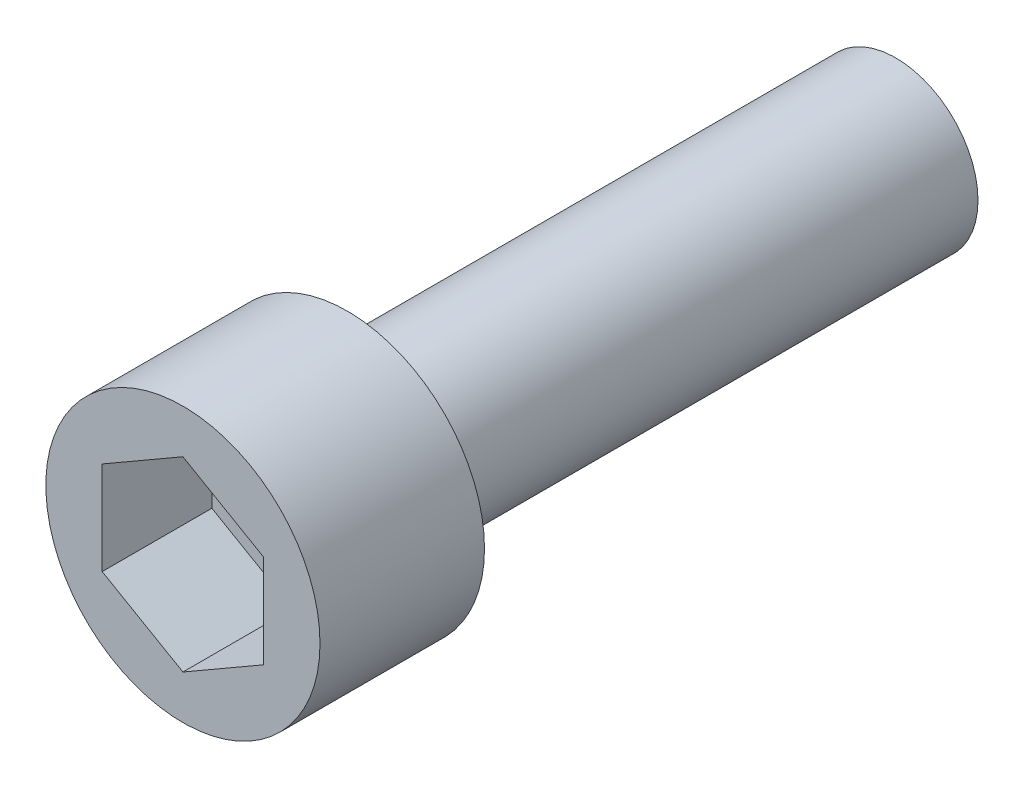
ISO-10303-21;
HEADER;
FILE_DESCRIPTION(('STEP AP214'),'2;1');
FILE_NAME('part.step','',(''),(''),'','','');
FILE_SCHEMA(('AUTOMOTIVE_DESIGN { 1 0 10303 214 1 1 1 1 }'));
ENDSEC;
DATA;
#1=APPLICATION_CONTEXT('core data for automotive mechanical design processes');
#2=APPLICATION_PROTOCOL_DEFINITION('international standard','automotive_design',2000,#1);
#3=PRODUCT_CONTEXT('',#1,'mechanical');
#4=PRODUCT('Part','Part','',(#3));
#5=PRODUCT_RELATED_PRODUCT_CATEGORY('part','',(#4));
#6=PRODUCT_DEFINITION_FORMATION('','',#4);
#7=PRODUCT_DEFINITION_CONTEXT('part definition',#1,'design');
#8=PRODUCT_DEFINITION('design','',#6,#7);
#9=PRODUCT_DEFINITION_SHAPE('','',#8);
#10=(LENGTH_UNIT() NAMED_UNIT(*) SI_UNIT(.MILLI.,.METRE.));
#11=(NAMED_UNIT(*) PLANE_ANGLE_UNIT() SI_UNIT($,.RADIAN.));
#12=(NAMED_UNIT(*) SI_UNIT($,.STERADIAN.) SOLID_ANGLE_UNIT());
#13=UNCERTAINTY_MEASURE_WITH_UNIT(LENGTH_MEASURE(1.E-05),#10,'distance_accuracy_value','');
#14=(GEOMETRIC_REPRESENTATION_CONTEXT(3) GLOBAL_UNCERTAINTY_ASSIGNED_CONTEXT((#13)) GLOBAL_UNIT_ASSIGNED_CONTEXT((#10,
#11,#12)) REPRESENTATION_CONTEXT('',''));
#15=CARTESIAN_POINT('',(0.,0.,0.));
#16=DIRECTION('',(0.,0.,1.));
#17=DIRECTION('',(1.,0.,0.));
#18=AXIS2_PLACEMENT_3D('',#15,#16,#17);
#19=CARTESIAN_POINT('',(0.,0.,10.));
#20=DIRECTION('',(0.,0.,-1.));
#21=DIRECTION('',(-1.,0.,0.));
#22=AXIS2_PLACEMENT_3D('',#19,#20,#21);
#23=CYLINDRICAL_SURFACE('',#22,1.5);
#24=CARTESIAN_POINT('',(0.,0.,10.));
#25=DIRECTION('',(0.,0.,1.));
#26=DIRECTION('',(1.,0.,0.));
#27=AXIS2_PLACEMENT_3D('',#24,#25,#26);
#28=CIRCLE('',#27,1.5);
#29=CARTESIAN_POINT('',(1.5,0.,10.));
#30=VERTEX_POINT('',#29);
#31=EDGE_CURVE('E11',#30,#30,#28,.T.);
#32=ORIENTED_EDGE('',*,*,#31,.F.);
#33=EDGE_LOOP('',(#32));
#34=FACE_BOUND('',#33,.T.);
#35=CARTESIAN_POINT('',(0.,0.,0.));
#36=DIRECTION('',(0.,0.,1.));
#37=DIRECTION('',(1.,0.,0.));
#38=AXIS2_PLACEMENT_3D('',#35,#36,#37);
#39=CIRCLE('',#38,1.5);
#40=CARTESIAN_POINT('',(1.5,0.,0.));
#41=VERTEX_POINT('',#40);
#42=EDGE_CURVE('E42',#41,#41,#39,.T.);
#43=ORIENTED_EDGE('',*,*,#42,.T.);
#44=EDGE_LOOP('',(#43));
#45=FACE_BOUND('',#44,.T.);
#46=ADVANCED_FACE('F39',(#34,#45),#23,.T.);
#47=CARTESIAN_POINT('',(0.,0.,0.));
#48=DIRECTION('',(0.,0.,1.));
#49=DIRECTION('',(1.,0.,0.));
#50=AXIS2_PLACEMENT_3D('',#47,#48,#49);
#51=PLANE('',#50);
#52=ORIENTED_EDGE('',*,*,#42,.F.);
#53=EDGE_LOOP('',(#52));
#54=FACE_BOUND('',#53,.T.);
#55=ADVANCED_FACE('F170',(#54),#51,.F.);
#56=CARTESIAN_POINT('',(0.,0.,13.));
#57=DIRECTION('',(0.,0.,-1.));
#58=DIRECTION('',(-1.,0.,0.));
#59=AXIS2_PLACEMENT_3D('',#56,#57,#58);
#60=CYLINDRICAL_SURFACE('',#59,2.5);
#61=CARTESIAN_POINT('',(0.,0.,13.));
#62=DIRECTION('',(0.,0.,1.));
#63=DIRECTION('',(1.,0.,0.));
#64=AXIS2_PLACEMENT_3D('',#61,#62,#63);
#65=CIRCLE('',#64,2.5);
#66=CARTESIAN_POINT('',(2.5,0.,13.));
#67=VERTEX_POINT('',#66);
#68=EDGE_CURVE('E146',#67,#67,#65,.T.);
#69=ORIENTED_EDGE('',*,*,#68,.F.);
#70=EDGE_LOOP('',(#69));
#71=FACE_BOUND('',#70,.T.);
#72=CARTESIAN_POINT('',(0.,0.,10.));
#73=DIRECTION('',(0.,0.,1.));
#74=DIRECTION('',(1.,0.,0.));
#75=AXIS2_PLACEMENT_3D('',#72,#73,#74);
#76=CIRCLE('',#75,2.5);
#77=CARTESIAN_POINT('',(2.5,0.,10.));
#78=VERTEX_POINT('',#77);
#79=EDGE_CURVE('E140',#78,#78,#76,.T.);
#80=ORIENTED_EDGE('',*,*,#79,.T.);
#81=EDGE_LOOP('',(#80));
#82=FACE_BOUND('',#81,.T.);
#83=ADVANCED_FACE('F152',(#71,#82),#60,.T.);
#84=CARTESIAN_POINT('',(0.,0.,13.));
#85=DIRECTION('',(0.,0.,1.));
#86=DIRECTION('',(1.,0.,0.));
#87=AXIS2_PLACEMENT_3D('',#84,#85,#86);
#88=PLANE('',#87);
#89=DIRECTION('',(-0.866025403784439,0.5,0.));
#90=VECTOR('',#89,1.);
#91=CARTESIAN_POINT('',(1.47224318643354,0.85,13.));
#92=LINE('',#91,#90);
#93=CARTESIAN_POINT('',(1.47224318643354,0.85,13.));
#94=VERTEX_POINT('',#93);
#95=CARTESIAN_POINT('',(0.,1.7,13.));
#96=VERTEX_POINT('',#95);
#97=EDGE_CURVE('E53',#94,#96,#92,.T.);
#98=ORIENTED_EDGE('',*,*,#97,.F.);
#99=DIRECTION('',(0.,1.,0.));
#100=VECTOR('',#99,1.);
#101=CARTESIAN_POINT('',(1.47224318643354,-0.85,13.));
#102=LINE('',#101,#100);
#103=CARTESIAN_POINT('',(1.47224318643354,-0.85,13.));
#104=VERTEX_POINT('',#103);
#105=EDGE_CURVE('E136',#104,#94,#102,.T.);
#106=ORIENTED_EDGE('',*,*,#105,.F.);
#107=DIRECTION('',(0.866025403784439,0.5,0.));
#108=VECTOR('',#107,1.);
#109=CARTESIAN_POINT('',(0.,-1.7,13.));
#110=LINE('',#109,#108);
#111=CARTESIAN_POINT('',(0.,-1.7,13.));
#112=VERTEX_POINT('',#111);
#113=EDGE_CURVE('E134',#112,#104,#110,.T.);
#114=ORIENTED_EDGE('',*,*,#113,.F.);
#115=DIRECTION('',(0.866025403784438,-0.5,0.));
#116=VECTOR('',#115,1.);
#117=CARTESIAN_POINT('',(-1.47224318643354,-0.849999999999999,13.));
#118=LINE('',#117,#116);
#119=CARTESIAN_POINT('',(-1.47224318643354,-0.849999999999999,13.));
#120=VERTEX_POINT('',#119);
#121=EDGE_CURVE('E101',#120,#112,#118,.T.);
#122=ORIENTED_EDGE('',*,*,#121,.F.);
#123=DIRECTION('',(0.,-1.,0.));
#124=VECTOR('',#123,1.);
#125=CARTESIAN_POINT('',(-1.47224318643354,0.85,13.));
#126=LINE('',#125,#124);
#127=CARTESIAN_POINT('',(-1.47224318643354,0.85,13.));
#128=VERTEX_POINT('',#127);
#129=EDGE_CURVE('E130',#128,#120,#126,.T.);
#130=ORIENTED_EDGE('',*,*,#129,.F.);
#131=DIRECTION('',(-0.866025403784439,-0.5,0.));
#132=VECTOR('',#131,1.);
#133=CARTESIAN_POINT('',(0.,1.7,13.));
#134=LINE('',#133,#132);
#135=EDGE_CURVE('E127',#96,#128,#134,.T.);
#136=ORIENTED_EDGE('',*,*,#135,.F.);
#137=EDGE_LOOP('',(#98,#106,#114,#122,#130,#136));
#138=FACE_BOUND('',#137,.T.);
#139=ORIENTED_EDGE('',*,*,#68,.T.);
#140=EDGE_LOOP('',(#139));
#141=FACE_BOUND('',#140,.T.);
#142=ADVANCED_FACE('F157',(#138,#141),#88,.T.);
#143=CARTESIAN_POINT('',(0.,0.,10.));
#144=DIRECTION('',(0.,0.,1.));
#145=DIRECTION('',(1.,0.,0.));
#146=AXIS2_PLACEMENT_3D('',#143,#144,#145);
#147=PLANE('',#146);
#148=ORIENTED_EDGE('',*,*,#31,.T.);
#149=EDGE_LOOP('',(#148));
#150=FACE_BOUND('',#149,.T.);
#151=ORIENTED_EDGE('',*,*,#79,.F.);
#152=EDGE_LOOP('',(#151));
#153=FACE_BOUND('',#152,.T.);
#154=ADVANCED_FACE('F154',(#150,#153),#147,.F.);
#155=CARTESIAN_POINT('',(1.47224318643354,0.85,11.));
#156=DIRECTION('',(0.5,0.866025403784439,0.));
#157=DIRECTION('',(-0.866025403784439,0.5,0.));
#158=AXIS2_PLACEMENT_3D('',#155,#156,#157);
#159=PLANE('',#158);
#160=ORIENTED_EDGE('',*,*,#97,.T.);
#161=DIRECTION('',(0.,0.,1.));
#162=VECTOR('',#161,1.);
#163=CARTESIAN_POINT('',(0.,1.7,11.));
#164=LINE('',#163,#162);
#165=CARTESIAN_POINT('',(0.,1.7,11.));
#166=VERTEX_POINT('',#165);
#167=EDGE_CURVE('E83',#166,#96,#164,.T.);
#168=ORIENTED_EDGE('',*,*,#167,.F.);
#169=DIRECTION('',(-0.866025403784439,0.5,0.));
#170=VECTOR('',#169,1.);
#171=CARTESIAN_POINT('',(1.47224318643354,0.85,11.));
#172=LINE('',#171,#170);
#173=CARTESIAN_POINT('',(1.47224318643354,0.85,11.));
#174=VERTEX_POINT('',#173);
#175=EDGE_CURVE('E138',#174,#166,#172,.T.);
#176=ORIENTED_EDGE('',*,*,#175,.F.);
#177=DIRECTION('',(0.,0.,1.));
#178=VECTOR('',#177,1.);
#179=CARTESIAN_POINT('',(1.47224318643354,0.85,11.));
#180=LINE('',#179,#178);
#181=EDGE_CURVE('E61',#174,#94,#180,.T.);
#182=ORIENTED_EDGE('',*,*,#181,.T.);
#183=EDGE_LOOP('',(#160,#168,#176,#182));
#184=FACE_BOUND('',#183,.T.);
#185=ADVANCED_FACE('F156',(#184),#159,.F.);
#186=CARTESIAN_POINT('',(1.47224318643354,-0.85,11.));
#187=DIRECTION('',(1.,0.,0.));
#188=DIRECTION('',(0.,0.,-1.));
#189=AXIS2_PLACEMENT_3D('',#186,#187,#188);
#190=PLANE('',#189);
#191=ORIENTED_EDGE('',*,*,#105,.T.);
#192=ORIENTED_EDGE('',*,*,#181,.F.);
#193=DIRECTION('',(0.,1.,0.));
#194=VECTOR('',#193,1.);
#195=CARTESIAN_POINT('',(1.47224318643354,-0.85,11.));
#196=LINE('',#195,#194);
#197=CARTESIAN_POINT('',(1.47224318643354,-0.85,11.));
#198=VERTEX_POINT('',#197);
#199=EDGE_CURVE('E113',#198,#174,#196,.T.);
#200=ORIENTED_EDGE('',*,*,#199,.F.);
#201=DIRECTION('',(0.,0.,1.));
#202=VECTOR('',#201,1.);
#203=CARTESIAN_POINT('',(1.47224318643354,-0.85,11.));
#204=LINE('',#203,#202);
#205=EDGE_CURVE('E105',#198,#104,#204,.T.);
#206=ORIENTED_EDGE('',*,*,#205,.T.);
#207=EDGE_LOOP('',(#191,#192,#200,#206));
#208=FACE_BOUND('',#207,.T.);
#209=ADVANCED_FACE('F164',(#208),#190,.F.);
#210=CARTESIAN_POINT('',(0.,-1.7,11.));
#211=DIRECTION('',(0.499999999999999,-0.866025403784439,0.));
#212=DIRECTION('',(0.866025403784439,0.5,0.));
#213=AXIS2_PLACEMENT_3D('',#210,#211,#212);
#214=PLANE('',#213);
#215=ORIENTED_EDGE('',*,*,#113,.T.);
#216=ORIENTED_EDGE('',*,*,#205,.F.);
#217=DIRECTION('',(0.866025403784439,0.5,0.));
#218=VECTOR('',#217,1.);
#219=CARTESIAN_POINT('',(0.,-1.7,11.));
#220=LINE('',#219,#218);
#221=CARTESIAN_POINT('',(0.,-1.7,11.));
#222=VERTEX_POINT('',#221);
#223=EDGE_CURVE('E109',#222,#198,#220,.T.);
#224=ORIENTED_EDGE('',*,*,#223,.F.);
#225=DIRECTION('',(0.,0.,1.));
#226=VECTOR('',#225,1.);
#227=CARTESIAN_POINT('',(0.,-1.7,11.));
#228=LINE('',#227,#226);
#229=EDGE_CURVE('E94',#222,#112,#228,.T.);
#230=ORIENTED_EDGE('',*,*,#229,.T.);
#231=EDGE_LOOP('',(#215,#216,#224,#230));
#232=FACE_BOUND('',#231,.T.);
#233=ADVANCED_FACE('F110',(#232),#214,.F.);
#234=CARTESIAN_POINT('',(-1.47224318643354,-0.849999999999999,11.));
#235=DIRECTION('',(-0.5,-0.866025403784439,0.));
#236=DIRECTION('',(0.866025403784438,-0.5,0.));
#237=AXIS2_PLACEMENT_3D('',#234,#235,#236);
#238=PLANE('',#237);
#239=ORIENTED_EDGE('',*,*,#121,.T.);
#240=ORIENTED_EDGE('',*,*,#229,.F.);
#241=DIRECTION('',(0.866025403784438,-0.5,0.));
#242=VECTOR('',#241,1.);
#243=CARTESIAN_POINT('',(-1.47224318643354,-0.849999999999999,11.));
#244=LINE('',#243,#242);
#245=CARTESIAN_POINT('',(-1.47224318643354,-0.849999999999999,11.));
#246=VERTEX_POINT('',#245);
#247=EDGE_CURVE('E98',#246,#222,#244,.T.);
#248=ORIENTED_EDGE('',*,*,#247,.F.);
#249=DIRECTION('',(0.,0.,1.));
#250=VECTOR('',#249,1.);
#251=CARTESIAN_POINT('',(-1.47224318643354,-0.849999999999999,11.));
#252=LINE('',#251,#250);
#253=EDGE_CURVE('E106',#246,#120,#252,.T.);
#254=ORIENTED_EDGE('',*,*,#253,.T.);
#255=EDGE_LOOP('',(#239,#240,#248,#254));
#256=FACE_BOUND('',#255,.T.);
#257=ADVANCED_FACE('F96',(#256),#238,.F.);
#258=CARTESIAN_POINT('',(-1.47224318643354,0.85,11.));
#259=DIRECTION('',(-1.,0.,0.));
#260=DIRECTION('',(0.,-1.,0.));
#261=AXIS2_PLACEMENT_3D('',#258,#259,#260);
#262=PLANE('',#261);
#263=ORIENTED_EDGE('',*,*,#129,.T.);
#264=ORIENTED_EDGE('',*,*,#253,.F.);
#265=DIRECTION('',(0.,-1.,0.));
#266=VECTOR('',#265,1.);
#267=CARTESIAN_POINT('',(-1.47224318643354,0.85,11.));
#268=LINE('',#267,#266);
#269=CARTESIAN_POINT('',(-1.47224318643354,0.85,11.));
#270=VERTEX_POINT('',#269);
#271=EDGE_CURVE('E119',#270,#246,#268,.T.);
#272=ORIENTED_EDGE('',*,*,#271,.F.);
#273=DIRECTION('',(0.,0.,1.));
#274=VECTOR('',#273,1.);
#275=CARTESIAN_POINT('',(-1.47224318643354,0.85,11.));
#276=LINE('',#275,#274);
#277=EDGE_CURVE('E143',#270,#128,#276,.T.);
#278=ORIENTED_EDGE('',*,*,#277,.T.);
#279=EDGE_LOOP('',(#263,#264,#272,#278));
#280=FACE_BOUND('',#279,.T.);
#281=ADVANCED_FACE('F229',(#280),#262,.F.);
#282=CARTESIAN_POINT('',(0.,1.7,11.));
#283=DIRECTION('',(-0.5,0.866025403784439,0.));
#284=DIRECTION('',(-0.866025403784439,-0.5,0.));
#285=AXIS2_PLACEMENT_3D('',#282,#283,#284);
#286=PLANE('',#285);
#287=ORIENTED_EDGE('',*,*,#135,.T.);
#288=ORIENTED_EDGE('',*,*,#277,.F.);
#289=DIRECTION('',(-0.866025403784439,-0.5,0.));
#290=VECTOR('',#289,1.);
#291=CARTESIAN_POINT('',(0.,1.7,11.));
#292=LINE('',#291,#290);
#293=EDGE_CURVE('E121',#166,#270,#292,.T.);
#294=ORIENTED_EDGE('',*,*,#293,.F.);
#295=ORIENTED_EDGE('',*,*,#167,.T.);
#296=EDGE_LOOP('',(#287,#288,#294,#295));
#297=FACE_BOUND('',#296,.T.);
#298=ADVANCED_FACE('F239',(#297),#286,.F.);
#299=CARTESIAN_POINT('',(0.,0.,11.));
#300=DIRECTION('',(0.,0.,1.));
#301=DIRECTION('',(1.,0.,0.));
#302=AXIS2_PLACEMENT_3D('',#299,#300,#301);
#303=PLANE('',#302);
#304=ORIENTED_EDGE('',*,*,#175,.T.);
#305=ORIENTED_EDGE('',*,*,#293,.T.);
#306=ORIENTED_EDGE('',*,*,#271,.T.);
#307=ORIENTED_EDGE('',*,*,#247,.T.);
#308=ORIENTED_EDGE('',*,*,#223,.T.);
#309=ORIENTED_EDGE('',*,*,#199,.T.);
#310=EDGE_LOOP('',(#304,#305,#306,#307,#308,#309));
#311=FACE_BOUND('',#310,.T.);
#312=ADVANCED_FACE('F116',(#311),#303,.T.);
#313=CLOSED_SHELL('',(#46,#55,#83,#142,#154,#185,#209,#233,#257,#281,#298,#312));
#314=MANIFOLD_SOLID_BREP('B2',#313);
#315=ADVANCED_BREP_SHAPE_REPRESENTATION('',(#18,#314),#14);
#316=SHAPE_DEFINITION_REPRESENTATION(#9,#315);
ENDSEC;
END-ISO-10303-21;
